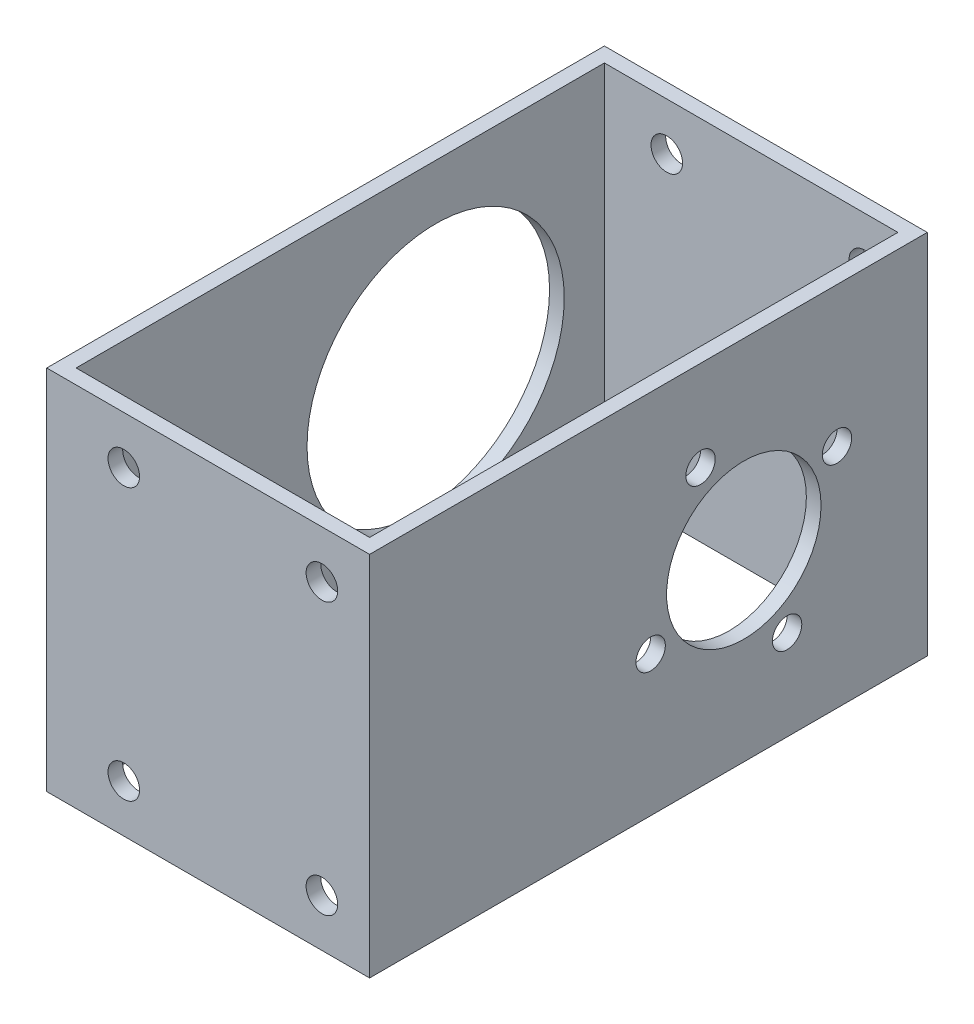
ISO-10303-21;
HEADER;
FILE_DESCRIPTION(('STEP AP214'),'2;1');
FILE_NAME('part.step','',(''),(''),'','','');
FILE_SCHEMA(('AUTOMOTIVE_DESIGN { 1 0 10303 214 1 1 1 1 }'));
ENDSEC;
DATA;
#1=APPLICATION_CONTEXT('core data for automotive mechanical design processes');
#2=APPLICATION_PROTOCOL_DEFINITION('international standard','automotive_design',2000,#1);
#3=PRODUCT_CONTEXT('',#1,'mechanical');
#4=PRODUCT('Part','Part','',(#3));
#5=PRODUCT_RELATED_PRODUCT_CATEGORY('part','',(#4));
#6=PRODUCT_DEFINITION_FORMATION('','',#4);
#7=PRODUCT_DEFINITION_CONTEXT('part definition',#1,'design');
#8=PRODUCT_DEFINITION('design','',#6,#7);
#9=PRODUCT_DEFINITION_SHAPE('','',#8);
#10=(LENGTH_UNIT() NAMED_UNIT(*) SI_UNIT(.MILLI.,.METRE.));
#11=(NAMED_UNIT(*) PLANE_ANGLE_UNIT() SI_UNIT($,.RADIAN.));
#12=(NAMED_UNIT(*) SI_UNIT($,.STERADIAN.) SOLID_ANGLE_UNIT());
#13=UNCERTAINTY_MEASURE_WITH_UNIT(LENGTH_MEASURE(1.E-05),#10,'distance_accuracy_value','');
#14=(GEOMETRIC_REPRESENTATION_CONTEXT(3) GLOBAL_UNCERTAINTY_ASSIGNED_CONTEXT((#13)) GLOBAL_UNIT_ASSIGNED_CONTEXT((#10,
#11,#12)) REPRESENTATION_CONTEXT('',''));
#15=CARTESIAN_POINT('',(0.,0.,0.));
#16=DIRECTION('',(0.,0.,1.));
#17=DIRECTION('',(1.,0.,0.));
#18=AXIS2_PLACEMENT_3D('',#15,#16,#17);
#19=CARTESIAN_POINT('',(0.,50.,0.));
#20=DIRECTION('',(0.,1.,0.));
#21=DIRECTION('',(0.,0.,1.));
#22=AXIS2_PLACEMENT_3D('',#19,#20,#21);
#23=PLANE('',#22);
#24=DIRECTION('',(0.,0.,1.));
#25=VECTOR('',#24,1.);
#26=CARTESIAN_POINT('',(0.,50.,0.));
#27=LINE('',#26,#25);
#28=CARTESIAN_POINT('',(0.,50.,0.));
#29=VERTEX_POINT('',#28);
#30=CARTESIAN_POINT('',(0.,50.,76.));
#31=VERTEX_POINT('',#30);
#32=EDGE_CURVE('E144',#29,#31,#27,.T.);
#33=ORIENTED_EDGE('',*,*,#32,.T.);
#34=DIRECTION('',(1.,0.,0.));
#35=VECTOR('',#34,1.);
#36=CARTESIAN_POINT('',(0.,50.,76.));
#37=LINE('',#36,#35);
#38=CARTESIAN_POINT('',(44.,50.,76.));
#39=VERTEX_POINT('',#38);
#40=EDGE_CURVE('E147',#31,#39,#37,.T.);
#41=ORIENTED_EDGE('',*,*,#40,.T.);
#42=DIRECTION('',(0.,0.,-1.));
#43=VECTOR('',#42,1.);
#44=CARTESIAN_POINT('',(44.,50.,0.));
#45=LINE('',#44,#43);
#46=CARTESIAN_POINT('',(44.,50.,0.));
#47=VERTEX_POINT('',#46);
#48=EDGE_CURVE('E150',#39,#47,#45,.T.);
#49=ORIENTED_EDGE('',*,*,#48,.T.);
#50=DIRECTION('',(-1.,0.,0.));
#51=VECTOR('',#50,1.);
#52=CARTESIAN_POINT('',(0.,50.,0.));
#53=LINE('',#52,#51);
#54=EDGE_CURVE('E152',#47,#29,#53,.T.);
#55=ORIENTED_EDGE('',*,*,#54,.T.);
#56=EDGE_LOOP('',(#33,#41,#49,#55));
#57=FACE_BOUND('',#56,.T.);
#58=DIRECTION('',(1.,0.,0.));
#59=VECTOR('',#58,1.);
#60=CARTESIAN_POINT('',(2.00000000000001,50.,74.));
#61=LINE('',#60,#59);
#62=CARTESIAN_POINT('',(2.00000000000001,50.,74.));
#63=VERTEX_POINT('',#62);
#64=CARTESIAN_POINT('',(42.,50.,74.));
#65=VERTEX_POINT('',#64);
#66=EDGE_CURVE('E114',#63,#65,#61,.T.);
#67=ORIENTED_EDGE('',*,*,#66,.F.);
#68=DIRECTION('',(0.,0.,1.));
#69=VECTOR('',#68,1.);
#70=CARTESIAN_POINT('',(2.,50.,2.));
#71=LINE('',#70,#69);
#72=CARTESIAN_POINT('',(2.,50.,2.));
#73=VERTEX_POINT('',#72);
#74=EDGE_CURVE('E106',#73,#63,#71,.T.);
#75=ORIENTED_EDGE('',*,*,#74,.F.);
#76=DIRECTION('',(-1.,0.,0.));
#77=VECTOR('',#76,1.);
#78=CARTESIAN_POINT('',(2.,50.,2.));
#79=LINE('',#78,#77);
#80=CARTESIAN_POINT('',(42.,50.,2.));
#81=VERTEX_POINT('',#80);
#82=EDGE_CURVE('E128',#81,#73,#79,.T.);
#83=ORIENTED_EDGE('',*,*,#82,.F.);
#84=DIRECTION('',(0.,0.,-1.));
#85=VECTOR('',#84,1.);
#86=CARTESIAN_POINT('',(42.,50.,2.));
#87=LINE('',#86,#85);
#88=EDGE_CURVE('E126',#65,#81,#87,.T.);
#89=ORIENTED_EDGE('',*,*,#88,.F.);
#90=EDGE_LOOP('',(#67,#75,#83,#89));
#91=FACE_BOUND('',#90,.T.);
#92=ADVANCED_FACE('F39',(#57,#91),#23,.T.);
#93=CARTESIAN_POINT('',(0.,0.,0.));
#94=DIRECTION('',(0.,1.,0.));
#95=DIRECTION('',(0.,0.,1.));
#96=AXIS2_PLACEMENT_3D('',#93,#94,#95);
#97=PLANE('',#96);
#98=DIRECTION('',(0.,0.,1.));
#99=VECTOR('',#98,1.);
#100=CARTESIAN_POINT('',(0.,0.,0.));
#101=LINE('',#100,#99);
#102=CARTESIAN_POINT('',(0.,0.,0.));
#103=VERTEX_POINT('',#102);
#104=CARTESIAN_POINT('',(0.,0.,76.));
#105=VERTEX_POINT('',#104);
#106=EDGE_CURVE('E122',#103,#105,#101,.T.);
#107=ORIENTED_EDGE('',*,*,#106,.F.);
#108=DIRECTION('',(-1.,0.,0.));
#109=VECTOR('',#108,1.);
#110=CARTESIAN_POINT('',(0.,0.,0.));
#111=LINE('',#110,#109);
#112=CARTESIAN_POINT('',(44.,0.,0.));
#113=VERTEX_POINT('',#112);
#114=EDGE_CURVE('E148',#113,#103,#111,.T.);
#115=ORIENTED_EDGE('',*,*,#114,.F.);
#116=DIRECTION('',(0.,0.,-1.));
#117=VECTOR('',#116,1.);
#118=CARTESIAN_POINT('',(44.,0.,0.));
#119=LINE('',#118,#117);
#120=CARTESIAN_POINT('',(44.,0.,76.));
#121=VERTEX_POINT('',#120);
#122=EDGE_CURVE('E159',#121,#113,#119,.T.);
#123=ORIENTED_EDGE('',*,*,#122,.F.);
#124=DIRECTION('',(1.,0.,0.));
#125=VECTOR('',#124,1.);
#126=CARTESIAN_POINT('',(0.,0.,76.));
#127=LINE('',#126,#125);
#128=EDGE_CURVE('E157',#105,#121,#127,.T.);
#129=ORIENTED_EDGE('',*,*,#128,.F.);
#130=EDGE_LOOP('',(#107,#115,#123,#129));
#131=FACE_BOUND('',#130,.T.);
#132=DIRECTION('',(0.,0.,1.));
#133=VECTOR('',#132,1.);
#134=CARTESIAN_POINT('',(2.,0.,2.));
#135=LINE('',#134,#133);
#136=CARTESIAN_POINT('',(2.,0.,2.));
#137=VERTEX_POINT('',#136);
#138=CARTESIAN_POINT('',(2.00000000000001,0.,74.));
#139=VERTEX_POINT('',#138);
#140=EDGE_CURVE('E64',#137,#139,#135,.T.);
#141=ORIENTED_EDGE('',*,*,#140,.T.);
#142=DIRECTION('',(1.,0.,0.));
#143=VECTOR('',#142,1.);
#144=CARTESIAN_POINT('',(2.00000000000001,0.,74.));
#145=LINE('',#144,#143);
#146=CARTESIAN_POINT('',(42.,0.,74.));
#147=VERTEX_POINT('',#146);
#148=EDGE_CURVE('E121',#139,#147,#145,.T.);
#149=ORIENTED_EDGE('',*,*,#148,.T.);
#150=DIRECTION('',(0.,0.,-1.));
#151=VECTOR('',#150,1.);
#152=CARTESIAN_POINT('',(42.,0.,2.));
#153=LINE('',#152,#151);
#154=CARTESIAN_POINT('',(42.,0.,2.));
#155=VERTEX_POINT('',#154);
#156=EDGE_CURVE('E136',#147,#155,#153,.T.);
#157=ORIENTED_EDGE('',*,*,#156,.T.);
#158=DIRECTION('',(-1.,0.,0.));
#159=VECTOR('',#158,1.);
#160=CARTESIAN_POINT('',(2.,0.,2.));
#161=LINE('',#160,#159);
#162=EDGE_CURVE('E115',#155,#137,#161,.T.);
#163=ORIENTED_EDGE('',*,*,#162,.T.);
#164=EDGE_LOOP('',(#141,#149,#157,#163));
#165=FACE_BOUND('',#164,.T.);
#166=ADVANCED_FACE('F272',(#131,#165),#97,.F.);
#167=CARTESIAN_POINT('',(0.,50.,0.));
#168=DIRECTION('',(1.,0.,0.));
#169=DIRECTION('',(0.,0.,-1.));
#170=AXIS2_PLACEMENT_3D('',#167,#168,#169);
#171=PLANE('',#170);
#172=CARTESIAN_POINT('',(0.,25.,25.));
#173=DIRECTION('',(-1.,0.,0.));
#174=DIRECTION('',(0.,0.,1.));
#175=AXIS2_PLACEMENT_3D('',#172,#173,#174);
#176=CIRCLE('',#175,17.525);
#177=CARTESIAN_POINT('',(0.,25.,42.525));
#178=VERTEX_POINT('',#177);
#179=EDGE_CURVE('E221',#178,#178,#176,.T.);
#180=ORIENTED_EDGE('',*,*,#179,.F.);
#181=EDGE_LOOP('',(#180));
#182=FACE_BOUND('',#181,.T.);
#183=ORIENTED_EDGE('',*,*,#106,.T.);
#184=DIRECTION('',(0.,-1.,0.));
#185=VECTOR('',#184,1.);
#186=CARTESIAN_POINT('',(0.,50.,76.));
#187=LINE('',#186,#185);
#188=EDGE_CURVE('E11',#31,#105,#187,.T.);
#189=ORIENTED_EDGE('',*,*,#188,.F.);
#190=ORIENTED_EDGE('',*,*,#32,.F.);
#191=DIRECTION('',(0.,-1.,0.));
#192=VECTOR('',#191,1.);
#193=CARTESIAN_POINT('',(0.,50.,0.));
#194=LINE('',#193,#192);
#195=EDGE_CURVE('E154',#29,#103,#194,.T.);
#196=ORIENTED_EDGE('',*,*,#195,.T.);
#197=EDGE_LOOP('',(#183,#189,#190,#196));
#198=FACE_BOUND('',#197,.T.);
#199=ADVANCED_FACE('F41',(#182,#198),#171,.F.);
#200=CARTESIAN_POINT('',(0.,50.,76.));
#201=DIRECTION('',(0.,0.,-1.));
#202=DIRECTION('',(-1.,0.,0.));
#203=AXIS2_PLACEMENT_3D('',#200,#201,#202);
#204=PLANE('',#203);
#205=CARTESIAN_POINT('',(10.5,43.5,76.));
#206=DIRECTION('',(0.,0.,-1.));
#207=DIRECTION('',(-1.,0.,0.));
#208=AXIS2_PLACEMENT_3D('',#205,#206,#207);
#209=CIRCLE('',#208,2.15);
#210=CARTESIAN_POINT('',(8.35,43.5,76.));
#211=VERTEX_POINT('',#210);
#212=EDGE_CURVE('E187',#211,#211,#209,.T.);
#213=ORIENTED_EDGE('',*,*,#212,.T.);
#214=EDGE_LOOP('',(#213));
#215=FACE_BOUND('',#214,.T.);
#216=CARTESIAN_POINT('',(10.5,6.5,76.));
#217=DIRECTION('',(0.,0.,-1.));
#218=DIRECTION('',(-1.,0.,0.));
#219=AXIS2_PLACEMENT_3D('',#216,#217,#218);
#220=CIRCLE('',#219,2.15);
#221=CARTESIAN_POINT('',(8.35,6.5,76.));
#222=VERTEX_POINT('',#221);
#223=EDGE_CURVE('E182',#222,#222,#220,.T.);
#224=ORIENTED_EDGE('',*,*,#223,.T.);
#225=EDGE_LOOP('',(#224));
#226=FACE_BOUND('',#225,.T.);
#227=CARTESIAN_POINT('',(37.5,43.5,76.));
#228=DIRECTION('',(0.,0.,-1.));
#229=DIRECTION('',(-1.,0.,0.));
#230=AXIS2_PLACEMENT_3D('',#227,#228,#229);
#231=CIRCLE('',#230,2.15);
#232=CARTESIAN_POINT('',(35.35,43.5,76.));
#233=VERTEX_POINT('',#232);
#234=EDGE_CURVE('E177',#233,#233,#231,.T.);
#235=ORIENTED_EDGE('',*,*,#234,.T.);
#236=EDGE_LOOP('',(#235));
#237=FACE_BOUND('',#236,.T.);
#238=CARTESIAN_POINT('',(37.5,6.5,76.));
#239=DIRECTION('',(0.,0.,-1.));
#240=DIRECTION('',(-1.,0.,0.));
#241=AXIS2_PLACEMENT_3D('',#238,#239,#240);
#242=CIRCLE('',#241,2.15);
#243=CARTESIAN_POINT('',(35.35,6.5,76.));
#244=VERTEX_POINT('',#243);
#245=EDGE_CURVE('E172',#244,#244,#242,.T.);
#246=ORIENTED_EDGE('',*,*,#245,.T.);
#247=EDGE_LOOP('',(#246));
#248=FACE_BOUND('',#247,.T.);
#249=ORIENTED_EDGE('',*,*,#128,.T.);
#250=DIRECTION('',(0.,-1.,0.));
#251=VECTOR('',#250,1.);
#252=CARTESIAN_POINT('',(44.,50.,76.));
#253=LINE('',#252,#251);
#254=EDGE_CURVE('E48',#39,#121,#253,.T.);
#255=ORIENTED_EDGE('',*,*,#254,.F.);
#256=ORIENTED_EDGE('',*,*,#40,.F.);
#257=ORIENTED_EDGE('',*,*,#188,.T.);
#258=EDGE_LOOP('',(#249,#255,#256,#257));
#259=FACE_BOUND('',#258,.T.);
#260=ADVANCED_FACE('F286',(#215,#226,#237,#248,#259),#204,.F.);
#261=CARTESIAN_POINT('',(44.,50.,0.));
#262=DIRECTION('',(-1.,0.,0.));
#263=DIRECTION('',(0.,0.,1.));
#264=AXIS2_PLACEMENT_3D('',#261,#262,#263);
#265=PLANE('',#264);
#266=CARTESIAN_POINT('',(44.,37.6960623816993,30.9));
#267=DIRECTION('',(1.,0.,0.));
#268=DIRECTION('',(0.,0.,-1.));
#269=AXIS2_PLACEMENT_3D('',#266,#267,#268);
#270=CIRCLE('',#269,2.00000000000001);
#271=CARTESIAN_POINT('',(44.,37.6960623816993,28.9));
#272=VERTEX_POINT('',#271);
#273=EDGE_CURVE('E208',#272,#272,#270,.T.);
#274=ORIENTED_EDGE('',*,*,#273,.F.);
#275=EDGE_LOOP('',(#274));
#276=FACE_BOUND('',#275,.T.);
#277=CARTESIAN_POINT('',(44.,19.1,37.6960623816993));
#278=DIRECTION('',(1.,0.,0.));
#279=DIRECTION('',(0.,0.,-1.));
#280=AXIS2_PLACEMENT_3D('',#277,#278,#279);
#281=CIRCLE('',#280,2.);
#282=CARTESIAN_POINT('',(44.,19.1,35.6960623816993));
#283=VERTEX_POINT('',#282);
#284=EDGE_CURVE('E198',#283,#283,#281,.T.);
#285=ORIENTED_EDGE('',*,*,#284,.F.);
#286=EDGE_LOOP('',(#285));
#287=FACE_BOUND('',#286,.T.);
#288=CARTESIAN_POINT('',(44.,12.3039376183007,19.1));
#289=DIRECTION('',(1.,0.,0.));
#290=DIRECTION('',(0.,0.,-1.));
#291=AXIS2_PLACEMENT_3D('',#288,#289,#290);
#292=CIRCLE('',#291,2.);
#293=CARTESIAN_POINT('',(44.,12.3039376183007,17.1));
#294=VERTEX_POINT('',#293);
#295=EDGE_CURVE('E195',#294,#294,#292,.T.);
#296=ORIENTED_EDGE('',*,*,#295,.F.);
#297=EDGE_LOOP('',(#296));
#298=FACE_BOUND('',#297,.T.);
#299=CARTESIAN_POINT('',(44.,30.9,12.3039376183007));
#300=DIRECTION('',(1.,0.,0.));
#301=DIRECTION('',(0.,0.,-1.));
#302=AXIS2_PLACEMENT_3D('',#299,#300,#301);
#303=CIRCLE('',#302,2.);
#304=CARTESIAN_POINT('',(44.,30.9,10.3039376183007));
#305=VERTEX_POINT('',#304);
#306=EDGE_CURVE('E192',#305,#305,#303,.T.);
#307=ORIENTED_EDGE('',*,*,#306,.F.);
#308=EDGE_LOOP('',(#307));
#309=FACE_BOUND('',#308,.T.);
#310=CARTESIAN_POINT('',(44.,25.,25.));
#311=DIRECTION('',(1.,0.,0.));
#312=DIRECTION('',(0.,0.,-1.));
#313=AXIS2_PLACEMENT_3D('',#310,#311,#312);
#314=CIRCLE('',#313,10.525);
#315=CARTESIAN_POINT('',(44.,25.,14.475));
#316=VERTEX_POINT('',#315);
#317=EDGE_CURVE('E213',#316,#316,#314,.T.);
#318=ORIENTED_EDGE('',*,*,#317,.F.);
#319=EDGE_LOOP('',(#318));
#320=FACE_BOUND('',#319,.T.);
#321=ORIENTED_EDGE('',*,*,#122,.T.);
#322=DIRECTION('',(0.,-1.,0.));
#323=VECTOR('',#322,1.);
#324=CARTESIAN_POINT('',(44.,50.,0.));
#325=LINE('',#324,#323);
#326=EDGE_CURVE('E164',#47,#113,#325,.T.);
#327=ORIENTED_EDGE('',*,*,#326,.F.);
#328=ORIENTED_EDGE('',*,*,#48,.F.);
#329=ORIENTED_EDGE('',*,*,#254,.T.);
#330=EDGE_LOOP('',(#321,#327,#328,#329));
#331=FACE_BOUND('',#330,.T.);
#332=ADVANCED_FACE('F283',(#276,#287,#298,#309,#320,#331),#265,.F.);
#333=CARTESIAN_POINT('',(0.,50.,0.));
#334=DIRECTION('',(0.,0.,1.));
#335=DIRECTION('',(1.,0.,0.));
#336=AXIS2_PLACEMENT_3D('',#333,#334,#335);
#337=PLANE('',#336);
#338=CARTESIAN_POINT('',(10.5,43.5,0.));
#339=DIRECTION('',(0.,0.,-1.));
#340=DIRECTION('',(-1.,0.,0.));
#341=AXIS2_PLACEMENT_3D('',#338,#339,#340);
#342=CIRCLE('',#341,2.15);
#343=CARTESIAN_POINT('',(8.35,43.5,0.));
#344=VERTEX_POINT('',#343);
#345=EDGE_CURVE('E224',#344,#344,#342,.T.);
#346=ORIENTED_EDGE('',*,*,#345,.F.);
#347=EDGE_LOOP('',(#346));
#348=FACE_BOUND('',#347,.T.);
#349=CARTESIAN_POINT('',(10.5,6.5,0.));
#350=DIRECTION('',(0.,0.,-1.));
#351=DIRECTION('',(-1.,0.,0.));
#352=AXIS2_PLACEMENT_3D('',#349,#350,#351);
#353=CIRCLE('',#352,2.15);
#354=CARTESIAN_POINT('',(8.35,6.5,0.));
#355=VERTEX_POINT('',#354);
#356=EDGE_CURVE('E231',#355,#355,#353,.T.);
#357=ORIENTED_EDGE('',*,*,#356,.F.);
#358=EDGE_LOOP('',(#357));
#359=FACE_BOUND('',#358,.T.);
#360=CARTESIAN_POINT('',(37.5,43.5,0.));
#361=DIRECTION('',(0.,0.,-1.));
#362=DIRECTION('',(-1.,0.,0.));
#363=AXIS2_PLACEMENT_3D('',#360,#361,#362);
#364=CIRCLE('',#363,2.15);
#365=CARTESIAN_POINT('',(35.35,43.5,0.));
#366=VERTEX_POINT('',#365);
#367=EDGE_CURVE('E238',#366,#366,#364,.T.);
#368=ORIENTED_EDGE('',*,*,#367,.F.);
#369=EDGE_LOOP('',(#368));
#370=FACE_BOUND('',#369,.T.);
#371=CARTESIAN_POINT('',(37.5,6.5,0.));
#372=DIRECTION('',(0.,0.,-1.));
#373=DIRECTION('',(-1.,0.,0.));
#374=AXIS2_PLACEMENT_3D('',#371,#372,#373);
#375=CIRCLE('',#374,2.15);
#376=CARTESIAN_POINT('',(35.35,6.5,0.));
#377=VERTEX_POINT('',#376);
#378=EDGE_CURVE('E245',#377,#377,#375,.T.);
#379=ORIENTED_EDGE('',*,*,#378,.F.);
#380=EDGE_LOOP('',(#379));
#381=FACE_BOUND('',#380,.T.);
#382=ORIENTED_EDGE('',*,*,#114,.T.);
#383=ORIENTED_EDGE('',*,*,#195,.F.);
#384=ORIENTED_EDGE('',*,*,#54,.F.);
#385=ORIENTED_EDGE('',*,*,#326,.T.);
#386=EDGE_LOOP('',(#382,#383,#384,#385));
#387=FACE_BOUND('',#386,.T.);
#388=ADVANCED_FACE('F266',(#348,#359,#370,#381,#387),#337,.F.);
#389=CARTESIAN_POINT('',(2.,50.,2.));
#390=DIRECTION('',(1.,0.,0.));
#391=DIRECTION('',(0.,0.,-1.));
#392=AXIS2_PLACEMENT_3D('',#389,#390,#391);
#393=PLANE('',#392);
#394=CARTESIAN_POINT('',(2.,25.,25.));
#395=DIRECTION('',(1.,0.,0.));
#396=DIRECTION('',(0.,0.,-1.));
#397=AXIS2_PLACEMENT_3D('',#394,#395,#396);
#398=CIRCLE('',#397,17.525);
#399=CARTESIAN_POINT('',(2.,25.,7.475));
#400=VERTEX_POINT('',#399);
#401=EDGE_CURVE('E216',#400,#400,#398,.F.);
#402=ORIENTED_EDGE('',*,*,#401,.T.);
#403=EDGE_LOOP('',(#402));
#404=FACE_BOUND('',#403,.T.);
#405=ORIENTED_EDGE('',*,*,#140,.F.);
#406=DIRECTION('',(0.,-1.,0.));
#407=VECTOR('',#406,1.);
#408=CARTESIAN_POINT('',(2.,50.,2.));
#409=LINE('',#408,#407);
#410=EDGE_CURVE('E110',#73,#137,#409,.T.);
#411=ORIENTED_EDGE('',*,*,#410,.F.);
#412=ORIENTED_EDGE('',*,*,#74,.T.);
#413=DIRECTION('',(0.,-1.,0.));
#414=VECTOR('',#413,1.);
#415=CARTESIAN_POINT('',(2.00000000000001,50.,74.));
#416=LINE('',#415,#414);
#417=EDGE_CURVE('E109',#63,#139,#416,.T.);
#418=ORIENTED_EDGE('',*,*,#417,.T.);
#419=EDGE_LOOP('',(#405,#411,#412,#418));
#420=FACE_BOUND('',#419,.T.);
#421=ADVANCED_FACE('F108',(#404,#420),#393,.T.);
#422=CARTESIAN_POINT('',(2.00000000000001,50.,74.));
#423=DIRECTION('',(0.,0.,-1.));
#424=DIRECTION('',(-1.,0.,0.));
#425=AXIS2_PLACEMENT_3D('',#422,#423,#424);
#426=PLANE('',#425);
#427=CARTESIAN_POINT('',(10.5,43.5,74.));
#428=DIRECTION('',(0.,0.,-1.));
#429=DIRECTION('',(-1.,0.,0.));
#430=AXIS2_PLACEMENT_3D('',#427,#428,#429);
#431=CIRCLE('',#430,2.15);
#432=CARTESIAN_POINT('',(8.35,43.5,74.));
#433=VERTEX_POINT('',#432);
#434=EDGE_CURVE('E186',#433,#433,#431,.T.);
#435=ORIENTED_EDGE('',*,*,#434,.F.);
#436=EDGE_LOOP('',(#435));
#437=FACE_BOUND('',#436,.T.);
#438=CARTESIAN_POINT('',(10.5,6.5,74.));
#439=DIRECTION('',(0.,0.,-1.));
#440=DIRECTION('',(-1.,0.,0.));
#441=AXIS2_PLACEMENT_3D('',#438,#439,#440);
#442=CIRCLE('',#441,2.15);
#443=CARTESIAN_POINT('',(8.35,6.5,74.));
#444=VERTEX_POINT('',#443);
#445=EDGE_CURVE('E181',#444,#444,#442,.T.);
#446=ORIENTED_EDGE('',*,*,#445,.F.);
#447=EDGE_LOOP('',(#446));
#448=FACE_BOUND('',#447,.T.);
#449=CARTESIAN_POINT('',(37.5,43.5,74.));
#450=DIRECTION('',(0.,0.,-1.));
#451=DIRECTION('',(-1.,0.,0.));
#452=AXIS2_PLACEMENT_3D('',#449,#450,#451);
#453=CIRCLE('',#452,2.15);
#454=CARTESIAN_POINT('',(35.35,43.5,74.));
#455=VERTEX_POINT('',#454);
#456=EDGE_CURVE('E176',#455,#455,#453,.T.);
#457=ORIENTED_EDGE('',*,*,#456,.F.);
#458=EDGE_LOOP('',(#457));
#459=FACE_BOUND('',#458,.T.);
#460=CARTESIAN_POINT('',(37.5,6.5,74.));
#461=DIRECTION('',(0.,0.,-1.));
#462=DIRECTION('',(-1.,0.,0.));
#463=AXIS2_PLACEMENT_3D('',#460,#461,#462);
#464=CIRCLE('',#463,2.15);
#465=CARTESIAN_POINT('',(35.35,6.5,74.));
#466=VERTEX_POINT('',#465);
#467=EDGE_CURVE('E134',#466,#466,#464,.T.);
#468=ORIENTED_EDGE('',*,*,#467,.F.);
#469=EDGE_LOOP('',(#468));
#470=FACE_BOUND('',#469,.T.);
#471=ORIENTED_EDGE('',*,*,#148,.F.);
#472=ORIENTED_EDGE('',*,*,#417,.F.);
#473=ORIENTED_EDGE('',*,*,#66,.T.);
#474=DIRECTION('',(0.,-1.,0.));
#475=VECTOR('',#474,1.);
#476=CARTESIAN_POINT('',(42.,50.,74.));
#477=LINE('',#476,#475);
#478=EDGE_CURVE('E123',#65,#147,#477,.T.);
#479=ORIENTED_EDGE('',*,*,#478,.T.);
#480=EDGE_LOOP('',(#471,#472,#473,#479));
#481=FACE_BOUND('',#480,.T.);
#482=ADVANCED_FACE('F118',(#437,#448,#459,#470,#481),#426,.T.);
#483=CARTESIAN_POINT('',(42.,50.,2.));
#484=DIRECTION('',(-1.,0.,0.));
#485=DIRECTION('',(0.,0.,1.));
#486=AXIS2_PLACEMENT_3D('',#483,#484,#485);
#487=PLANE('',#486);
#488=CARTESIAN_POINT('',(42.,37.6960623816993,30.9));
#489=DIRECTION('',(-1.,0.,0.));
#490=DIRECTION('',(0.,0.,1.));
#491=AXIS2_PLACEMENT_3D('',#488,#489,#490);
#492=CIRCLE('',#491,2.00000000000001);
#493=CARTESIAN_POINT('',(42.,37.6960623816993,32.9));
#494=VERTEX_POINT('',#493);
#495=EDGE_CURVE('E43',#494,#494,#492,.T.);
#496=ORIENTED_EDGE('',*,*,#495,.F.);
#497=EDGE_LOOP('',(#496));
#498=FACE_BOUND('',#497,.T.);
#499=CARTESIAN_POINT('',(42.,19.1,37.6960623816993));
#500=DIRECTION('',(-1.,0.,0.));
#501=DIRECTION('',(0.,0.,1.));
#502=AXIS2_PLACEMENT_3D('',#499,#500,#501);
#503=CIRCLE('',#502,2.);
#504=CARTESIAN_POINT('',(42.,19.1,39.6960623816993));
#505=VERTEX_POINT('',#504);
#506=EDGE_CURVE('E196',#505,#505,#503,.T.);
#507=ORIENTED_EDGE('',*,*,#506,.F.);
#508=EDGE_LOOP('',(#507));
#509=FACE_BOUND('',#508,.T.);
#510=CARTESIAN_POINT('',(42.,12.3039376183007,19.1));
#511=DIRECTION('',(-1.,0.,0.));
#512=DIRECTION('',(0.,0.,1.));
#513=AXIS2_PLACEMENT_3D('',#510,#511,#512);
#514=CIRCLE('',#513,2.);
#515=CARTESIAN_POINT('',(42.,12.3039376183007,21.1));
#516=VERTEX_POINT('',#515);
#517=EDGE_CURVE('E193',#516,#516,#514,.T.);
#518=ORIENTED_EDGE('',*,*,#517,.F.);
#519=EDGE_LOOP('',(#518));
#520=FACE_BOUND('',#519,.T.);
#521=CARTESIAN_POINT('',(42.,30.9,12.3039376183007));
#522=DIRECTION('',(-1.,0.,0.));
#523=DIRECTION('',(0.,0.,1.));
#524=AXIS2_PLACEMENT_3D('',#521,#522,#523);
#525=CIRCLE('',#524,2.);
#526=CARTESIAN_POINT('',(42.,30.9,14.3039376183007));
#527=VERTEX_POINT('',#526);
#528=EDGE_CURVE('E188',#527,#527,#525,.T.);
#529=ORIENTED_EDGE('',*,*,#528,.F.);
#530=EDGE_LOOP('',(#529));
#531=FACE_BOUND('',#530,.T.);
#532=CARTESIAN_POINT('',(42.,25.,25.));
#533=DIRECTION('',(-1.,0.,0.));
#534=DIRECTION('',(0.,0.,1.));
#535=AXIS2_PLACEMENT_3D('',#532,#533,#534);
#536=CIRCLE('',#535,10.525);
#537=CARTESIAN_POINT('',(42.,25.,35.525));
#538=VERTEX_POINT('',#537);
#539=EDGE_CURVE('E191',#538,#538,#536,.F.);
#540=ORIENTED_EDGE('',*,*,#539,.T.);
#541=EDGE_LOOP('',(#540));
#542=FACE_BOUND('',#541,.T.);
#543=ORIENTED_EDGE('',*,*,#156,.F.);
#544=ORIENTED_EDGE('',*,*,#478,.F.);
#545=ORIENTED_EDGE('',*,*,#88,.T.);
#546=DIRECTION('',(0.,-1.,0.));
#547=VECTOR('',#546,1.);
#548=CARTESIAN_POINT('',(42.,50.,2.));
#549=LINE('',#548,#547);
#550=EDGE_CURVE('E56',#81,#155,#549,.T.);
#551=ORIENTED_EDGE('',*,*,#550,.T.);
#552=EDGE_LOOP('',(#543,#544,#545,#551));
#553=FACE_BOUND('',#552,.T.);
#554=ADVANCED_FACE('F256',(#498,#509,#520,#531,#542,#553),#487,.T.);
#555=CARTESIAN_POINT('',(2.,50.,2.));
#556=DIRECTION('',(0.,0.,1.));
#557=DIRECTION('',(1.,0.,0.));
#558=AXIS2_PLACEMENT_3D('',#555,#556,#557);
#559=PLANE('',#558);
#560=CARTESIAN_POINT('',(10.5,43.5,2.));
#561=DIRECTION('',(0.,0.,1.));
#562=DIRECTION('',(1.,0.,0.));
#563=AXIS2_PLACEMENT_3D('',#560,#561,#562);
#564=CIRCLE('',#563,2.15);
#565=CARTESIAN_POINT('',(12.65,43.5,2.));
#566=VERTEX_POINT('',#565);
#567=EDGE_CURVE('E183',#566,#566,#564,.T.);
#568=ORIENTED_EDGE('',*,*,#567,.F.);
#569=EDGE_LOOP('',(#568));
#570=FACE_BOUND('',#569,.T.);
#571=CARTESIAN_POINT('',(10.5,6.5,2.));
#572=DIRECTION('',(0.,0.,1.));
#573=DIRECTION('',(1.,0.,0.));
#574=AXIS2_PLACEMENT_3D('',#571,#572,#573);
#575=CIRCLE('',#574,2.15);
#576=CARTESIAN_POINT('',(12.65,6.5,2.));
#577=VERTEX_POINT('',#576);
#578=EDGE_CURVE('E178',#577,#577,#575,.T.);
#579=ORIENTED_EDGE('',*,*,#578,.F.);
#580=EDGE_LOOP('',(#579));
#581=FACE_BOUND('',#580,.T.);
#582=CARTESIAN_POINT('',(37.5,43.5,2.));
#583=DIRECTION('',(0.,0.,1.));
#584=DIRECTION('',(1.,0.,0.));
#585=AXIS2_PLACEMENT_3D('',#582,#583,#584);
#586=CIRCLE('',#585,2.15);
#587=CARTESIAN_POINT('',(39.65,43.5,2.));
#588=VERTEX_POINT('',#587);
#589=EDGE_CURVE('E173',#588,#588,#586,.T.);
#590=ORIENTED_EDGE('',*,*,#589,.F.);
#591=EDGE_LOOP('',(#590));
#592=FACE_BOUND('',#591,.T.);
#593=CARTESIAN_POINT('',(37.5,6.5,2.));
#594=DIRECTION('',(0.,0.,1.));
#595=DIRECTION('',(1.,0.,0.));
#596=AXIS2_PLACEMENT_3D('',#593,#594,#595);
#597=CIRCLE('',#596,2.15);
#598=CARTESIAN_POINT('',(39.65,6.5,2.));
#599=VERTEX_POINT('',#598);
#600=EDGE_CURVE('E169',#599,#599,#597,.T.);
#601=ORIENTED_EDGE('',*,*,#600,.F.);
#602=EDGE_LOOP('',(#601));
#603=FACE_BOUND('',#602,.T.);
#604=ORIENTED_EDGE('',*,*,#162,.F.);
#605=ORIENTED_EDGE('',*,*,#550,.F.);
#606=ORIENTED_EDGE('',*,*,#82,.T.);
#607=ORIENTED_EDGE('',*,*,#410,.T.);
#608=EDGE_LOOP('',(#604,#605,#606,#607));
#609=FACE_BOUND('',#608,.T.);
#610=ADVANCED_FACE('F263',(#570,#581,#592,#603,#609),#559,.T.);
#611=CARTESIAN_POINT('',(37.5,6.5,76.));
#612=DIRECTION('',(0.,0.,-1.));
#613=DIRECTION('',(-1.,0.,0.));
#614=AXIS2_PLACEMENT_3D('',#611,#612,#613);
#615=CYLINDRICAL_SURFACE('',#614,2.15);
#616=ORIENTED_EDGE('',*,*,#600,.T.);
#617=EDGE_LOOP('',(#616));
#618=FACE_BOUND('',#617,.T.);
#619=ORIENTED_EDGE('',*,*,#378,.T.);
#620=EDGE_LOOP('',(#619));
#621=FACE_BOUND('',#620,.T.);
#622=ADVANCED_FACE('F318',(#618,#621),#615,.F.);
#623=ORIENTED_EDGE('',*,*,#467,.T.);
#624=EDGE_LOOP('',(#623));
#625=FACE_BOUND('',#624,.T.);
#626=ORIENTED_EDGE('',*,*,#245,.F.);
#627=EDGE_LOOP('',(#626));
#628=FACE_BOUND('',#627,.T.);
#629=ADVANCED_FACE('F252',(#625,#628),#615,.F.);
#630=CARTESIAN_POINT('',(37.5,43.5,76.));
#631=DIRECTION('',(0.,0.,-1.));
#632=DIRECTION('',(-1.,0.,0.));
#633=AXIS2_PLACEMENT_3D('',#630,#631,#632);
#634=CYLINDRICAL_SURFACE('',#633,2.15);
#635=ORIENTED_EDGE('',*,*,#589,.T.);
#636=EDGE_LOOP('',(#635));
#637=FACE_BOUND('',#636,.T.);
#638=ORIENTED_EDGE('',*,*,#367,.T.);
#639=EDGE_LOOP('',(#638));
#640=FACE_BOUND('',#639,.T.);
#641=ADVANCED_FACE('F329',(#637,#640),#634,.F.);
#642=ORIENTED_EDGE('',*,*,#456,.T.);
#643=EDGE_LOOP('',(#642));
#644=FACE_BOUND('',#643,.T.);
#645=ORIENTED_EDGE('',*,*,#234,.F.);
#646=EDGE_LOOP('',(#645));
#647=FACE_BOUND('',#646,.T.);
#648=ADVANCED_FACE('F332',(#644,#647),#634,.F.);
#649=CARTESIAN_POINT('',(10.5,6.5,76.));
#650=DIRECTION('',(0.,0.,-1.));
#651=DIRECTION('',(-1.,0.,0.));
#652=AXIS2_PLACEMENT_3D('',#649,#650,#651);
#653=CYLINDRICAL_SURFACE('',#652,2.15);
#654=ORIENTED_EDGE('',*,*,#578,.T.);
#655=EDGE_LOOP('',(#654));
#656=FACE_BOUND('',#655,.T.);
#657=ORIENTED_EDGE('',*,*,#356,.T.);
#658=EDGE_LOOP('',(#657));
#659=FACE_BOUND('',#658,.T.);
#660=ADVANCED_FACE('F334',(#656,#659),#653,.F.);
#661=ORIENTED_EDGE('',*,*,#445,.T.);
#662=EDGE_LOOP('',(#661));
#663=FACE_BOUND('',#662,.T.);
#664=ORIENTED_EDGE('',*,*,#223,.F.);
#665=EDGE_LOOP('',(#664));
#666=FACE_BOUND('',#665,.T.);
#667=ADVANCED_FACE('F337',(#663,#666),#653,.F.);
#668=CARTESIAN_POINT('',(10.5,43.5,76.));
#669=DIRECTION('',(0.,0.,-1.));
#670=DIRECTION('',(-1.,0.,0.));
#671=AXIS2_PLACEMENT_3D('',#668,#669,#670);
#672=CYLINDRICAL_SURFACE('',#671,2.15);
#673=ORIENTED_EDGE('',*,*,#567,.T.);
#674=EDGE_LOOP('',(#673));
#675=FACE_BOUND('',#674,.T.);
#676=ORIENTED_EDGE('',*,*,#345,.T.);
#677=EDGE_LOOP('',(#676));
#678=FACE_BOUND('',#677,.T.);
#679=ADVANCED_FACE('F339',(#675,#678),#672,.F.);
#680=ORIENTED_EDGE('',*,*,#434,.T.);
#681=EDGE_LOOP('',(#680));
#682=FACE_BOUND('',#681,.T.);
#683=ORIENTED_EDGE('',*,*,#212,.F.);
#684=EDGE_LOOP('',(#683));
#685=FACE_BOUND('',#684,.T.);
#686=ADVANCED_FACE('F342',(#682,#685),#672,.F.);
#687=CARTESIAN_POINT('',(44.001,25.,25.));
#688=DIRECTION('',(-1.,0.,0.));
#689=DIRECTION('',(0.,0.,1.));
#690=AXIS2_PLACEMENT_3D('',#687,#688,#689);
#691=CYLINDRICAL_SURFACE('',#690,17.525);
#692=ORIENTED_EDGE('',*,*,#401,.F.);
#693=EDGE_LOOP('',(#692));
#694=FACE_BOUND('',#693,.T.);
#695=ORIENTED_EDGE('',*,*,#179,.T.);
#696=EDGE_LOOP('',(#695));
#697=FACE_BOUND('',#696,.T.);
#698=ADVANCED_FACE('F344',(#694,#697),#691,.F.);
#699=CARTESIAN_POINT('',(-0.00100000000000794,25.,25.));
#700=DIRECTION('',(1.,0.,0.));
#701=DIRECTION('',(0.,0.,-1.));
#702=AXIS2_PLACEMENT_3D('',#699,#700,#701);
#703=CYLINDRICAL_SURFACE('',#702,10.525);
#704=ORIENTED_EDGE('',*,*,#539,.F.);
#705=EDGE_LOOP('',(#704));
#706=FACE_BOUND('',#705,.T.);
#707=ORIENTED_EDGE('',*,*,#317,.T.);
#708=EDGE_LOOP('',(#707));
#709=FACE_BOUND('',#708,.T.);
#710=ADVANCED_FACE('F347',(#706,#709),#703,.F.);
#711=CARTESIAN_POINT('',(34.,30.9,12.3039376183007));
#712=DIRECTION('',(1.,0.,0.));
#713=DIRECTION('',(0.,0.,-1.));
#714=AXIS2_PLACEMENT_3D('',#711,#712,#713);
#715=CYLINDRICAL_SURFACE('',#714,2.);
#716=ORIENTED_EDGE('',*,*,#528,.T.);
#717=EDGE_LOOP('',(#716));
#718=FACE_BOUND('',#717,.T.);
#719=ORIENTED_EDGE('',*,*,#306,.T.);
#720=EDGE_LOOP('',(#719));
#721=FACE_BOUND('',#720,.T.);
#722=ADVANCED_FACE('F351',(#718,#721),#715,.F.);
#723=CARTESIAN_POINT('',(34.,12.3039376183007,19.1));
#724=DIRECTION('',(1.,0.,0.));
#725=DIRECTION('',(0.,0.,-1.));
#726=AXIS2_PLACEMENT_3D('',#723,#724,#725);
#727=CYLINDRICAL_SURFACE('',#726,2.);
#728=ORIENTED_EDGE('',*,*,#517,.T.);
#729=EDGE_LOOP('',(#728));
#730=FACE_BOUND('',#729,.T.);
#731=ORIENTED_EDGE('',*,*,#295,.T.);
#732=EDGE_LOOP('',(#731));
#733=FACE_BOUND('',#732,.T.);
#734=ADVANCED_FACE('F355',(#730,#733),#727,.F.);
#735=CARTESIAN_POINT('',(34.,19.1,37.6960623816993));
#736=DIRECTION('',(1.,0.,0.));
#737=DIRECTION('',(0.,0.,-1.));
#738=AXIS2_PLACEMENT_3D('',#735,#736,#737);
#739=CYLINDRICAL_SURFACE('',#738,2.);
#740=ORIENTED_EDGE('',*,*,#506,.T.);
#741=EDGE_LOOP('',(#740));
#742=FACE_BOUND('',#741,.T.);
#743=ORIENTED_EDGE('',*,*,#284,.T.);
#744=EDGE_LOOP('',(#743));
#745=FACE_BOUND('',#744,.T.);
#746=ADVANCED_FACE('F359',(#742,#745),#739,.F.);
#747=CARTESIAN_POINT('',(34.,37.6960623816993,30.9));
#748=DIRECTION('',(1.,0.,0.));
#749=DIRECTION('',(0.,0.,-1.));
#750=AXIS2_PLACEMENT_3D('',#747,#748,#749);
#751=CYLINDRICAL_SURFACE('',#750,2.00000000000001);
#752=ORIENTED_EDGE('',*,*,#495,.T.);
#753=EDGE_LOOP('',(#752));
#754=FACE_BOUND('',#753,.T.);
#755=ORIENTED_EDGE('',*,*,#273,.T.);
#756=EDGE_LOOP('',(#755));
#757=FACE_BOUND('',#756,.T.);
#758=ADVANCED_FACE('F363',(#754,#757),#751,.F.);
#759=CLOSED_SHELL('',(#92,#166,#199,#260,#332,#388,#421,#482,#554,#610,#622,#629,#641,#648,#660,
#667,#679,#686,#698,#710,#722,#734,#746,#758));
#760=MANIFOLD_SOLID_BREP('B2',#759);
#761=ADVANCED_BREP_SHAPE_REPRESENTATION('',(#18,#760),#14);
#762=SHAPE_DEFINITION_REPRESENTATION(#9,#761);
ENDSEC;
END-ISO-10303-21;
